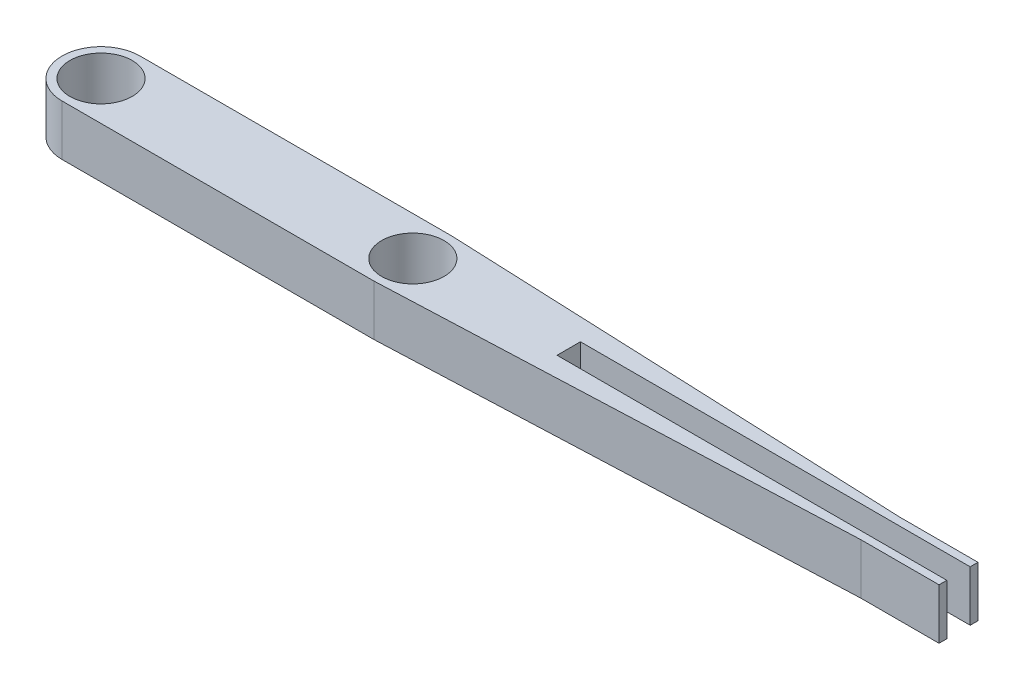
ISO-10303-21;
HEADER;
FILE_DESCRIPTION(('STEP AP214'),'2;1');
FILE_NAME('part.step','',(''),(''),'','','');
FILE_SCHEMA(('AUTOMOTIVE_DESIGN { 1 0 10303 214 1 1 1 1 }'));
ENDSEC;
DATA;
#1=APPLICATION_CONTEXT('core data for automotive mechanical design processes');
#2=APPLICATION_PROTOCOL_DEFINITION('international standard','automotive_design',2000,#1);
#3=PRODUCT_CONTEXT('',#1,'mechanical');
#4=PRODUCT('Part','Part','',(#3));
#5=PRODUCT_RELATED_PRODUCT_CATEGORY('part','',(#4));
#6=PRODUCT_DEFINITION_FORMATION('','',#4);
#7=PRODUCT_DEFINITION_CONTEXT('part definition',#1,'design');
#8=PRODUCT_DEFINITION('design','',#6,#7);
#9=PRODUCT_DEFINITION_SHAPE('','',#8);
#10=(LENGTH_UNIT() NAMED_UNIT(*) SI_UNIT(.MILLI.,.METRE.));
#11=(NAMED_UNIT(*) PLANE_ANGLE_UNIT() SI_UNIT($,.RADIAN.));
#12=(NAMED_UNIT(*) SI_UNIT($,.STERADIAN.) SOLID_ANGLE_UNIT());
#13=UNCERTAINTY_MEASURE_WITH_UNIT(LENGTH_MEASURE(1.E-05),#10,'distance_accuracy_value','');
#14=(GEOMETRIC_REPRESENTATION_CONTEXT(3) GLOBAL_UNCERTAINTY_ASSIGNED_CONTEXT((#13)) GLOBAL_UNIT_ASSIGNED_CONTEXT((#10,
#11,#12)) REPRESENTATION_CONTEXT('',''));
#15=CARTESIAN_POINT('',(0.,0.,0.));
#16=DIRECTION('',(0.,0.,1.));
#17=DIRECTION('',(1.,0.,0.));
#18=AXIS2_PLACEMENT_3D('',#15,#16,#17);
#19=CARTESIAN_POINT('',(0.,6.5,0.));
#20=DIRECTION('',(0.,1.,0.));
#21=DIRECTION('',(0.,0.,1.));
#22=AXIS2_PLACEMENT_3D('',#19,#20,#21);
#23=PLANE('',#22);
#24=CARTESIAN_POINT('',(40.,6.5,0.));
#25=DIRECTION('',(0.,1.,0.));
#26=DIRECTION('',(0.,0.,1.));
#27=AXIS2_PLACEMENT_3D('',#24,#25,#26);
#28=CIRCLE('',#27,4.);
#29=CARTESIAN_POINT('',(40.,6.5,-4.));
#30=VERTEX_POINT('',#29);
#31=EDGE_CURVE('E129',#30,#30,#28,.T.);
#32=ORIENTED_EDGE('',*,*,#31,.F.);
#33=EDGE_LOOP('',(#32));
#34=FACE_BOUND('',#33,.T.);
#35=CARTESIAN_POINT('',(0.,6.5,0.));
#36=DIRECTION('',(0.,1.,0.));
#37=DIRECTION('',(0.,0.,1.));
#38=AXIS2_PLACEMENT_3D('',#35,#36,#37);
#39=CIRCLE('',#38,4.);
#40=CARTESIAN_POINT('',(0.,6.5,-4.));
#41=VERTEX_POINT('',#40);
#42=EDGE_CURVE('E125',#41,#41,#39,.T.);
#43=ORIENTED_EDGE('',*,*,#42,.F.);
#44=EDGE_LOOP('',(#43));
#45=FACE_BOUND('',#44,.T.);
#46=DIRECTION('',(0.,0.,-1.));
#47=VECTOR('',#46,1.);
#48=CARTESIAN_POINT('',(60.,6.5,1.50000000000001));
#49=LINE('',#48,#47);
#50=CARTESIAN_POINT('',(60.,6.5,1.50000000000001));
#51=VERTEX_POINT('',#50);
#52=CARTESIAN_POINT('',(60.,6.5,-1.5));
#53=VERTEX_POINT('',#52);
#54=EDGE_CURVE('E165',#51,#53,#49,.T.);
#55=ORIENTED_EDGE('',*,*,#54,.T.);
#56=DIRECTION('',(1.,0.,0.));
#57=VECTOR('',#56,1.);
#58=CARTESIAN_POINT('',(60.,6.5,-1.5));
#59=LINE('',#58,#57);
#60=CARTESIAN_POINT('',(110.,6.5,-1.5));
#61=VERTEX_POINT('',#60);
#62=EDGE_CURVE('E162',#53,#61,#59,.T.);
#63=ORIENTED_EDGE('',*,*,#62,.T.);
#64=DIRECTION('',(0.,0.,1.));
#65=VECTOR('',#64,1.);
#66=CARTESIAN_POINT('',(110.,6.5,-1.5));
#67=LINE('',#66,#65);
#68=CARTESIAN_POINT('',(110.,6.5,-2.5));
#69=VERTEX_POINT('',#68);
#70=EDGE_CURVE('E200',#69,#61,#67,.T.);
#71=ORIENTED_EDGE('',*,*,#70,.F.);
#72=DIRECTION('',(-1.,0.,0.));
#73=VECTOR('',#72,1.);
#74=CARTESIAN_POINT('',(110.,6.5,-2.5));
#75=LINE('',#74,#73);
#76=CARTESIAN_POINT('',(100.,6.5,-2.5));
#77=VERTEX_POINT('',#76);
#78=EDGE_CURVE('E203',#69,#77,#75,.T.);
#79=ORIENTED_EDGE('',*,*,#78,.T.);
#80=DIRECTION('',(0.999133073092352,0.,0.0416305447121813));
#81=VECTOR('',#80,1.);
#82=CARTESIAN_POINT('',(0.277296360485268,6.5,-6.65511265164644));
#83=LINE('',#82,#81);
#84=CARTESIAN_POINT('',(40.,6.5,-5.));
#85=VERTEX_POINT('',#84);
#86=EDGE_CURVE('E148',#85,#77,#83,.T.);
#87=ORIENTED_EDGE('',*,*,#86,.F.);
#88=DIRECTION('',(1.,0.,0.));
#89=VECTOR('',#88,1.);
#90=CARTESIAN_POINT('',(0.,6.5,-5.));
#91=LINE('',#90,#89);
#92=CARTESIAN_POINT('',(0.,6.5,-5.));
#93=VERTEX_POINT('',#92);
#94=EDGE_CURVE('E110',#93,#85,#91,.T.);
#95=ORIENTED_EDGE('',*,*,#94,.F.);
#96=CARTESIAN_POINT('',(0.,6.5,0.));
#97=DIRECTION('',(0.,1.,0.));
#98=DIRECTION('',(0.,0.,1.));
#99=AXIS2_PLACEMENT_3D('',#96,#97,#98);
#100=CIRCLE('',#99,5.);
#101=CARTESIAN_POINT('',(0.,6.5,5.));
#102=VERTEX_POINT('',#101);
#103=EDGE_CURVE('E104',#93,#102,#100,.T.);
#104=ORIENTED_EDGE('',*,*,#103,.T.);
#105=DIRECTION('',(1.,0.,0.));
#106=VECTOR('',#105,1.);
#107=CARTESIAN_POINT('',(0.,6.5,5.));
#108=LINE('',#107,#106);
#109=CARTESIAN_POINT('',(40.,6.5,5.));
#110=VERTEX_POINT('',#109);
#111=EDGE_CURVE('E96',#102,#110,#108,.T.);
#112=ORIENTED_EDGE('',*,*,#111,.T.);
#113=DIRECTION('',(0.999133073092352,0.,-0.0416305447121813));
#114=VECTOR('',#113,1.);
#115=CARTESIAN_POINT('',(0.277296360485268,6.5,6.65511265164644));
#116=LINE('',#115,#114);
#117=CARTESIAN_POINT('',(100.,6.5,2.5));
#118=VERTEX_POINT('',#117);
#119=EDGE_CURVE('E57',#110,#118,#116,.T.);
#120=ORIENTED_EDGE('',*,*,#119,.T.);
#121=DIRECTION('',(-1.,0.,0.));
#122=VECTOR('',#121,1.);
#123=CARTESIAN_POINT('',(110.,6.5,2.5));
#124=LINE('',#123,#122);
#125=CARTESIAN_POINT('',(110.,6.5,2.5));
#126=VERTEX_POINT('',#125);
#127=EDGE_CURVE('E176',#126,#118,#124,.T.);
#128=ORIENTED_EDGE('',*,*,#127,.F.);
#129=DIRECTION('',(0.,0.,1.));
#130=VECTOR('',#129,1.);
#131=CARTESIAN_POINT('',(110.,6.5,2.5));
#132=LINE('',#131,#130);
#133=CARTESIAN_POINT('',(110.,6.5,1.50000000000001));
#134=VERTEX_POINT('',#133);
#135=EDGE_CURVE('E179',#134,#126,#132,.T.);
#136=ORIENTED_EDGE('',*,*,#135,.F.);
#137=DIRECTION('',(1.,0.,0.));
#138=VECTOR('',#137,1.);
#139=CARTESIAN_POINT('',(60.,6.5,1.50000000000001));
#140=LINE('',#139,#138);
#141=EDGE_CURVE('E158',#51,#134,#140,.T.);
#142=ORIENTED_EDGE('',*,*,#141,.F.);
#143=EDGE_LOOP('',(#55,#63,#71,#79,#87,#95,#104,#112,#120,#128,#136,#142));
#144=FACE_BOUND('',#143,.T.);
#145=ADVANCED_FACE('F40',(#34,#45,#144),#23,.T.);
#146=CARTESIAN_POINT('',(0.,0.,0.));
#147=DIRECTION('',(0.,1.,0.));
#148=DIRECTION('',(0.,0.,1.));
#149=AXIS2_PLACEMENT_3D('',#146,#147,#148);
#150=PLANE('',#149);
#151=CARTESIAN_POINT('',(0.,0.,0.));
#152=DIRECTION('',(0.,1.,0.));
#153=DIRECTION('',(0.,0.,1.));
#154=AXIS2_PLACEMENT_3D('',#151,#152,#153);
#155=CIRCLE('',#154,4.);
#156=CARTESIAN_POINT('',(0.,0.,-4.));
#157=VERTEX_POINT('',#156);
#158=EDGE_CURVE('E126',#157,#157,#155,.T.);
#159=ORIENTED_EDGE('',*,*,#158,.T.);
#160=EDGE_LOOP('',(#159));
#161=FACE_BOUND('',#160,.T.);
#162=CARTESIAN_POINT('',(40.,0.,0.));
#163=DIRECTION('',(0.,1.,0.));
#164=DIRECTION('',(0.,0.,1.));
#165=AXIS2_PLACEMENT_3D('',#162,#163,#164);
#166=CIRCLE('',#165,4.);
#167=CARTESIAN_POINT('',(40.,0.,-4.));
#168=VERTEX_POINT('',#167);
#169=EDGE_CURVE('E140',#168,#168,#166,.T.);
#170=ORIENTED_EDGE('',*,*,#169,.T.);
#171=EDGE_LOOP('',(#170));
#172=FACE_BOUND('',#171,.T.);
#173=DIRECTION('',(1.,0.,0.));
#174=VECTOR('',#173,1.);
#175=CARTESIAN_POINT('',(60.,0.,-1.5));
#176=LINE('',#175,#174);
#177=CARTESIAN_POINT('',(60.,0.,-1.5));
#178=VERTEX_POINT('',#177);
#179=CARTESIAN_POINT('',(110.,0.,-1.5));
#180=VERTEX_POINT('',#179);
#181=EDGE_CURVE('E170',#178,#180,#176,.T.);
#182=ORIENTED_EDGE('',*,*,#181,.F.);
#183=DIRECTION('',(0.,0.,-1.));
#184=VECTOR('',#183,1.);
#185=CARTESIAN_POINT('',(60.,0.,1.50000000000001));
#186=LINE('',#185,#184);
#187=CARTESIAN_POINT('',(60.,0.,1.50000000000001));
#188=VERTEX_POINT('',#187);
#189=EDGE_CURVE('E161',#188,#178,#186,.T.);
#190=ORIENTED_EDGE('',*,*,#189,.F.);
#191=DIRECTION('',(1.,0.,0.));
#192=VECTOR('',#191,1.);
#193=CARTESIAN_POINT('',(60.,0.,1.50000000000001));
#194=LINE('',#193,#192);
#195=CARTESIAN_POINT('',(110.,0.,1.50000000000001));
#196=VERTEX_POINT('',#195);
#197=EDGE_CURVE('E157',#188,#196,#194,.T.);
#198=ORIENTED_EDGE('',*,*,#197,.T.);
#199=DIRECTION('',(0.,0.,-1.));
#200=VECTOR('',#199,1.);
#201=CARTESIAN_POINT('',(110.,0.,2.5));
#202=LINE('',#201,#200);
#203=CARTESIAN_POINT('',(110.,0.,2.5));
#204=VERTEX_POINT('',#203);
#205=EDGE_CURVE('E185',#204,#196,#202,.T.);
#206=ORIENTED_EDGE('',*,*,#205,.F.);
#207=DIRECTION('',(-1.,0.,0.));
#208=VECTOR('',#207,1.);
#209=CARTESIAN_POINT('',(110.,0.,2.5));
#210=LINE('',#209,#208);
#211=CARTESIAN_POINT('',(100.,0.,2.5));
#212=VERTEX_POINT('',#211);
#213=EDGE_CURVE('E167',#204,#212,#210,.T.);
#214=ORIENTED_EDGE('',*,*,#213,.T.);
#215=DIRECTION('',(0.999133073092352,0.,-0.0416305447121813));
#216=VECTOR('',#215,1.);
#217=CARTESIAN_POINT('',(0.277296360485268,0.,6.65511265164644));
#218=LINE('',#217,#216);
#219=CARTESIAN_POINT('',(40.,0.,5.));
#220=VERTEX_POINT('',#219);
#221=EDGE_CURVE('E76',#220,#212,#218,.T.);
#222=ORIENTED_EDGE('',*,*,#221,.F.);
#223=DIRECTION('',(1.,0.,0.));
#224=VECTOR('',#223,1.);
#225=CARTESIAN_POINT('',(0.,0.,5.));
#226=LINE('',#225,#224);
#227=CARTESIAN_POINT('',(0.,0.,5.));
#228=VERTEX_POINT('',#227);
#229=EDGE_CURVE('E131',#228,#220,#226,.T.);
#230=ORIENTED_EDGE('',*,*,#229,.F.);
#231=CARTESIAN_POINT('',(0.,0.,0.));
#232=DIRECTION('',(0.,1.,0.));
#233=DIRECTION('',(0.,0.,1.));
#234=AXIS2_PLACEMENT_3D('',#231,#232,#233);
#235=CIRCLE('',#234,5.);
#236=CARTESIAN_POINT('',(0.,0.,-5.));
#237=VERTEX_POINT('',#236);
#238=EDGE_CURVE('E115',#237,#228,#235,.T.);
#239=ORIENTED_EDGE('',*,*,#238,.F.);
#240=DIRECTION('',(1.,0.,0.));
#241=VECTOR('',#240,1.);
#242=CARTESIAN_POINT('',(0.,0.,-5.));
#243=LINE('',#242,#241);
#244=CARTESIAN_POINT('',(40.,0.,-5.));
#245=VERTEX_POINT('',#244);
#246=EDGE_CURVE('E134',#237,#245,#243,.T.);
#247=ORIENTED_EDGE('',*,*,#246,.T.);
#248=DIRECTION('',(0.999133073092352,0.,0.0416305447121813));
#249=VECTOR('',#248,1.);
#250=CARTESIAN_POINT('',(0.277296360485268,0.,-6.65511265164644));
#251=LINE('',#250,#249);
#252=CARTESIAN_POINT('',(100.,0.,-2.5));
#253=VERTEX_POINT('',#252);
#254=EDGE_CURVE('E137',#245,#253,#251,.T.);
#255=ORIENTED_EDGE('',*,*,#254,.T.);
#256=DIRECTION('',(-1.,0.,0.));
#257=VECTOR('',#256,1.);
#258=CARTESIAN_POINT('',(110.,0.,-2.5));
#259=LINE('',#258,#257);
#260=CARTESIAN_POINT('',(110.,0.,-2.5));
#261=VERTEX_POINT('',#260);
#262=EDGE_CURVE('E206',#261,#253,#259,.T.);
#263=ORIENTED_EDGE('',*,*,#262,.F.);
#264=DIRECTION('',(0.,0.,-1.));
#265=VECTOR('',#264,1.);
#266=CARTESIAN_POINT('',(110.,0.,-1.5));
#267=LINE('',#266,#265);
#268=EDGE_CURVE('E194',#180,#261,#267,.T.);
#269=ORIENTED_EDGE('',*,*,#268,.F.);
#270=EDGE_LOOP('',(#182,#190,#198,#206,#214,#222,#230,#239,#247,#255,#263,#269));
#271=FACE_BOUND('',#270,.T.);
#272=ADVANCED_FACE('F222',(#161,#172,#271),#150,.F.);
#273=CARTESIAN_POINT('',(0.277296360485268,6.5,-6.65511265164644));
#274=DIRECTION('',(0.0416305447121813,0.,-0.999133073092352));
#275=DIRECTION('',(-0.999133073092352,0.,-0.0416305447121813));
#276=AXIS2_PLACEMENT_3D('',#273,#274,#275);
#277=PLANE('',#276);
#278=ORIENTED_EDGE('',*,*,#254,.F.);
#279=DIRECTION('',(0.,-1.,0.));
#280=VECTOR('',#279,1.);
#281=CARTESIAN_POINT('',(40.,6.5,-5.));
#282=LINE('',#281,#280);
#283=EDGE_CURVE('E11',#85,#245,#282,.T.);
#284=ORIENTED_EDGE('',*,*,#283,.F.);
#285=ORIENTED_EDGE('',*,*,#86,.T.);
#286=DIRECTION('',(0.,-1.,0.));
#287=VECTOR('',#286,1.);
#288=CARTESIAN_POINT('',(100.,6.5,-2.5));
#289=LINE('',#288,#287);
#290=EDGE_CURVE('E122',#77,#253,#289,.T.);
#291=ORIENTED_EDGE('',*,*,#290,.T.);
#292=EDGE_LOOP('',(#278,#284,#285,#291));
#293=FACE_BOUND('',#292,.T.);
#294=ADVANCED_FACE('F220',(#293),#277,.T.);
#295=CARTESIAN_POINT('',(0.,6.5,-5.));
#296=DIRECTION('',(0.,0.,-1.));
#297=DIRECTION('',(-1.,0.,0.));
#298=AXIS2_PLACEMENT_3D('',#295,#296,#297);
#299=PLANE('',#298);
#300=ORIENTED_EDGE('',*,*,#246,.F.);
#301=DIRECTION('',(0.,-1.,0.));
#302=VECTOR('',#301,1.);
#303=CARTESIAN_POINT('',(0.,6.5,-5.));
#304=LINE('',#303,#302);
#305=EDGE_CURVE('E49',#93,#237,#304,.T.);
#306=ORIENTED_EDGE('',*,*,#305,.F.);
#307=ORIENTED_EDGE('',*,*,#94,.T.);
#308=ORIENTED_EDGE('',*,*,#283,.T.);
#309=EDGE_LOOP('',(#300,#306,#307,#308));
#310=FACE_BOUND('',#309,.T.);
#311=ADVANCED_FACE('F225',(#310),#299,.T.);
#312=CARTESIAN_POINT('',(0.,6.5,0.));
#313=DIRECTION('',(0.,-1.,0.));
#314=DIRECTION('',(0.,0.,-1.));
#315=AXIS2_PLACEMENT_3D('',#312,#313,#314);
#316=CYLINDRICAL_SURFACE('',#315,5.);
#317=ORIENTED_EDGE('',*,*,#238,.T.);
#318=DIRECTION('',(0.,-1.,0.));
#319=VECTOR('',#318,1.);
#320=CARTESIAN_POINT('',(0.,6.5,5.));
#321=LINE('',#320,#319);
#322=EDGE_CURVE('E101',#102,#228,#321,.T.);
#323=ORIENTED_EDGE('',*,*,#322,.F.);
#324=ORIENTED_EDGE('',*,*,#103,.F.);
#325=ORIENTED_EDGE('',*,*,#305,.T.);
#326=EDGE_LOOP('',(#317,#323,#324,#325));
#327=FACE_BOUND('',#326,.T.);
#328=ADVANCED_FACE('F113',(#327),#316,.T.);
#329=CARTESIAN_POINT('',(0.,6.5,5.));
#330=DIRECTION('',(0.,0.,-1.));
#331=DIRECTION('',(-1.,0.,0.));
#332=AXIS2_PLACEMENT_3D('',#329,#330,#331);
#333=PLANE('',#332);
#334=ORIENTED_EDGE('',*,*,#229,.T.);
#335=DIRECTION('',(0.,-1.,0.));
#336=VECTOR('',#335,1.);
#337=CARTESIAN_POINT('',(40.,6.5,5.));
#338=LINE('',#337,#336);
#339=EDGE_CURVE('E103',#110,#220,#338,.T.);
#340=ORIENTED_EDGE('',*,*,#339,.F.);
#341=ORIENTED_EDGE('',*,*,#111,.F.);
#342=ORIENTED_EDGE('',*,*,#322,.T.);
#343=EDGE_LOOP('',(#334,#340,#341,#342));
#344=FACE_BOUND('',#343,.T.);
#345=ADVANCED_FACE('F99',(#344),#333,.F.);
#346=CARTESIAN_POINT('',(0.277296360485268,6.5,6.65511265164644));
#347=DIRECTION('',(-0.0416305447121813,0.,-0.999133073092352));
#348=DIRECTION('',(-0.999133073092352,0.,0.0416305447121813));
#349=AXIS2_PLACEMENT_3D('',#346,#347,#348);
#350=PLANE('',#349);
#351=ORIENTED_EDGE('',*,*,#221,.T.);
#352=DIRECTION('',(0.,-1.,0.));
#353=VECTOR('',#352,1.);
#354=CARTESIAN_POINT('',(100.,6.5,2.5));
#355=LINE('',#354,#353);
#356=EDGE_CURVE('E117',#118,#212,#355,.T.);
#357=ORIENTED_EDGE('',*,*,#356,.F.);
#358=ORIENTED_EDGE('',*,*,#119,.F.);
#359=ORIENTED_EDGE('',*,*,#339,.T.);
#360=EDGE_LOOP('',(#351,#357,#358,#359));
#361=FACE_BOUND('',#360,.T.);
#362=ADVANCED_FACE('F251',(#361),#350,.F.);
#363=CARTESIAN_POINT('',(40.,6.5,0.));
#364=DIRECTION('',(0.,-1.,0.));
#365=DIRECTION('',(0.,0.,-1.));
#366=AXIS2_PLACEMENT_3D('',#363,#364,#365);
#367=CYLINDRICAL_SURFACE('',#366,4.);
#368=CARTESIAN_POINT('',(40.,6.5,-4.));
#369=CARTESIAN_POINT('',(40.,6.43229166666667,-4.));
#370=CARTESIAN_POINT('',(40.,6.36458333333333,-4.));
#371=CARTESIAN_POINT('',(40.,6.22916666666667,-4.));
#372=CARTESIAN_POINT('',(40.,6.16145833333333,-4.));
#373=CARTESIAN_POINT('',(40.,6.02604166666667,-4.));
#374=CARTESIAN_POINT('',(40.,5.95833333333333,-4.));
#375=CARTESIAN_POINT('',(40.,5.82291666666667,-4.));
#376=CARTESIAN_POINT('',(40.,5.75520833333333,-4.));
#377=CARTESIAN_POINT('',(40.,5.61979166666667,-4.));
#378=CARTESIAN_POINT('',(40.,5.55208333333333,-4.));
#379=CARTESIAN_POINT('',(40.,5.41666666666667,-4.));
#380=CARTESIAN_POINT('',(40.,5.34895833333333,-4.));
#381=CARTESIAN_POINT('',(40.,5.21354166666667,-4.));
#382=CARTESIAN_POINT('',(40.,5.14583333333333,-4.));
#383=CARTESIAN_POINT('',(40.,5.01041666666667,-4.));
#384=CARTESIAN_POINT('',(40.,4.94270833333333,-4.));
#385=CARTESIAN_POINT('',(40.,4.80729166666667,-4.));
#386=CARTESIAN_POINT('',(40.,4.73958333333333,-4.));
#387=CARTESIAN_POINT('',(40.,4.60416666666667,-4.));
#388=CARTESIAN_POINT('',(40.,4.53645833333333,-4.));
#389=CARTESIAN_POINT('',(40.,4.40104166666667,-4.));
#390=CARTESIAN_POINT('',(40.,4.33333333333333,-4.));
#391=CARTESIAN_POINT('',(40.,4.19791666666667,-4.));
#392=CARTESIAN_POINT('',(40.,4.13020833333333,-4.));
#393=CARTESIAN_POINT('',(40.,3.99479166666667,-4.));
#394=CARTESIAN_POINT('',(40.,3.92708333333333,-4.));
#395=CARTESIAN_POINT('',(40.,3.79166666666667,-4.));
#396=CARTESIAN_POINT('',(40.,3.72395833333333,-4.));
#397=CARTESIAN_POINT('',(40.,3.58854166666667,-4.));
#398=CARTESIAN_POINT('',(40.,3.52083333333333,-4.));
#399=CARTESIAN_POINT('',(40.,3.38541666666667,-4.));
#400=CARTESIAN_POINT('',(40.,3.31770833333333,-4.));
#401=CARTESIAN_POINT('',(40.,3.18229166666667,-4.));
#402=CARTESIAN_POINT('',(40.,3.11458333333333,-4.));
#403=CARTESIAN_POINT('',(40.,2.97916666666667,-4.));
#404=CARTESIAN_POINT('',(40.,2.91145833333333,-4.));
#405=CARTESIAN_POINT('',(40.,2.77604166666667,-4.));
#406=CARTESIAN_POINT('',(40.,2.70833333333333,-4.));
#407=CARTESIAN_POINT('',(40.,2.57291666666667,-4.));
#408=CARTESIAN_POINT('',(40.,2.50520833333333,-4.));
#409=CARTESIAN_POINT('',(40.,2.36979166666667,-4.));
#410=CARTESIAN_POINT('',(40.,2.30208333333333,-4.));
#411=CARTESIAN_POINT('',(40.,2.16666666666667,-4.));
#412=CARTESIAN_POINT('',(40.,2.09895833333333,-4.));
#413=CARTESIAN_POINT('',(40.,1.96354166666667,-4.));
#414=CARTESIAN_POINT('',(40.,1.89583333333333,-4.));
#415=CARTESIAN_POINT('',(40.,1.76041666666667,-4.));
#416=CARTESIAN_POINT('',(40.,1.69270833333333,-4.));
#417=CARTESIAN_POINT('',(40.,1.55729166666667,-4.));
#418=CARTESIAN_POINT('',(40.,1.48958333333333,-4.));
#419=CARTESIAN_POINT('',(40.,1.35416666666667,-4.));
#420=CARTESIAN_POINT('',(40.,1.28645833333333,-4.));
#421=CARTESIAN_POINT('',(40.,1.15104166666667,-4.));
#422=CARTESIAN_POINT('',(40.,1.08333333333333,-4.));
#423=CARTESIAN_POINT('',(40.,0.947916666666667,-4.));
#424=CARTESIAN_POINT('',(40.,0.880208333333333,-4.));
#425=CARTESIAN_POINT('',(40.,0.744791666666667,-4.));
#426=CARTESIAN_POINT('',(40.,0.677083333333333,-4.));
#427=CARTESIAN_POINT('',(40.,0.541666666666667,-4.));
#428=CARTESIAN_POINT('',(40.,0.473958333333333,-4.));
#429=CARTESIAN_POINT('',(40.,0.338541666666667,-4.));
#430=CARTESIAN_POINT('',(40.,0.270833333333334,-4.));
#431=CARTESIAN_POINT('',(40.,0.135416666666667,-4.));
#432=CARTESIAN_POINT('',(40.,0.0677083333333334,-4.));
#433=CARTESIAN_POINT('',(40.,0.,-4.));
#434=B_SPLINE_CURVE_WITH_KNOTS('',3,(#368,#369,#370,#371,#372,#373,#374,#375,#376,#377,#378,
#379,#380,#381,#382,#383,#384,#385,#386,#387,#388,#389,#390,#391,#392,#393,#394,#395,#396,#397,
#398,#399,#400,#401,#402,#403,#404,#405,#406,#407,#408,#409,#410,#411,#412,#413,#414,#415,#416,
#417,#418,#419,#420,#421,#422,#423,#424,#425,#426,#427,#428,#429,#430,#431,#432,#433),
.UNSPECIFIED.,.F.,.F.,(4,2,2,2,2,2,2,2,2,2,2,2,2,2,2,2,2,2,2,2,2,2,2,2,2,2,2,2,2,2,2,2,4),(0.,
0.203125,0.40625,0.609375000000001,0.812500000000001,1.015625,1.21875,1.421875,1.625,1.828125,
2.03125,2.234375,2.4375,2.640625,2.84375,3.046875,3.25,3.453125,3.65625,3.859375,4.0625,
4.265625,4.46875,4.671875,4.875,5.078125,5.28125,5.484375,5.6875,5.890625,6.09375,6.296875,6.5),.UNSPECIFIED.);
#435=EDGE_CURVE('BSEAM42',#30,#168,#434,.T.);
#436=ORIENTED_EDGE('',*,*,#31,.T.);
#437=ORIENTED_EDGE('',*,*,#169,.F.);
#438=ORIENTED_EDGE('',*,*,#435,.T.);
#439=ORIENTED_EDGE('',*,*,#435,.F.);
#440=EDGE_LOOP('',(#436,#438,#437,#439));
#441=FACE_BOUND('',#440,.T.);
#442=ADVANCED_FACE('F42',(#441),#367,.F.);
#443=CARTESIAN_POINT('',(0.,6.5,0.));
#444=DIRECTION('',(0.,-1.,0.));
#445=DIRECTION('',(0.,0.,-1.));
#446=AXIS2_PLACEMENT_3D('',#443,#444,#445);
#447=CYLINDRICAL_SURFACE('',#446,4.);
#448=CARTESIAN_POINT('',(0.,6.5,-4.));
#449=CARTESIAN_POINT('',(0.,6.43229166666667,-4.));
#450=CARTESIAN_POINT('',(0.,6.36458333333333,-4.));
#451=CARTESIAN_POINT('',(0.,6.22916666666667,-4.));
#452=CARTESIAN_POINT('',(0.,6.16145833333333,-4.));
#453=CARTESIAN_POINT('',(0.,6.02604166666667,-4.));
#454=CARTESIAN_POINT('',(0.,5.95833333333333,-4.));
#455=CARTESIAN_POINT('',(0.,5.82291666666667,-4.));
#456=CARTESIAN_POINT('',(0.,5.75520833333333,-4.));
#457=CARTESIAN_POINT('',(0.,5.61979166666667,-4.));
#458=CARTESIAN_POINT('',(0.,5.55208333333333,-4.));
#459=CARTESIAN_POINT('',(0.,5.41666666666667,-4.));
#460=CARTESIAN_POINT('',(0.,5.34895833333333,-4.));
#461=CARTESIAN_POINT('',(0.,5.21354166666667,-4.));
#462=CARTESIAN_POINT('',(0.,5.14583333333333,-4.));
#463=CARTESIAN_POINT('',(0.,5.01041666666667,-4.));
#464=CARTESIAN_POINT('',(0.,4.94270833333333,-4.));
#465=CARTESIAN_POINT('',(0.,4.80729166666667,-4.));
#466=CARTESIAN_POINT('',(0.,4.73958333333333,-4.));
#467=CARTESIAN_POINT('',(0.,4.60416666666667,-4.));
#468=CARTESIAN_POINT('',(0.,4.53645833333333,-4.));
#469=CARTESIAN_POINT('',(0.,4.40104166666667,-4.));
#470=CARTESIAN_POINT('',(0.,4.33333333333333,-4.));
#471=CARTESIAN_POINT('',(0.,4.19791666666667,-4.));
#472=CARTESIAN_POINT('',(0.,4.13020833333333,-4.));
#473=CARTESIAN_POINT('',(0.,3.99479166666667,-4.));
#474=CARTESIAN_POINT('',(0.,3.92708333333333,-4.));
#475=CARTESIAN_POINT('',(0.,3.79166666666667,-4.));
#476=CARTESIAN_POINT('',(0.,3.72395833333333,-4.));
#477=CARTESIAN_POINT('',(0.,3.58854166666667,-4.));
#478=CARTESIAN_POINT('',(0.,3.52083333333333,-4.));
#479=CARTESIAN_POINT('',(0.,3.38541666666667,-4.));
#480=CARTESIAN_POINT('',(0.,3.31770833333333,-4.));
#481=CARTESIAN_POINT('',(0.,3.18229166666667,-4.));
#482=CARTESIAN_POINT('',(0.,3.11458333333333,-4.));
#483=CARTESIAN_POINT('',(0.,2.97916666666667,-4.));
#484=CARTESIAN_POINT('',(0.,2.91145833333333,-4.));
#485=CARTESIAN_POINT('',(0.,2.77604166666667,-4.));
#486=CARTESIAN_POINT('',(0.,2.70833333333333,-4.));
#487=CARTESIAN_POINT('',(0.,2.57291666666667,-4.));
#488=CARTESIAN_POINT('',(0.,2.50520833333333,-4.));
#489=CARTESIAN_POINT('',(0.,2.36979166666667,-4.));
#490=CARTESIAN_POINT('',(0.,2.30208333333333,-4.));
#491=CARTESIAN_POINT('',(0.,2.16666666666667,-4.));
#492=CARTESIAN_POINT('',(0.,2.09895833333333,-4.));
#493=CARTESIAN_POINT('',(0.,1.96354166666667,-4.));
#494=CARTESIAN_POINT('',(0.,1.89583333333333,-4.));
#495=CARTESIAN_POINT('',(0.,1.76041666666667,-4.));
#496=CARTESIAN_POINT('',(0.,1.69270833333333,-4.));
#497=CARTESIAN_POINT('',(0.,1.55729166666667,-4.));
#498=CARTESIAN_POINT('',(0.,1.48958333333333,-4.));
#499=CARTESIAN_POINT('',(0.,1.35416666666667,-4.));
#500=CARTESIAN_POINT('',(0.,1.28645833333333,-4.));
#501=CARTESIAN_POINT('',(0.,1.15104166666667,-4.));
#502=CARTESIAN_POINT('',(0.,1.08333333333333,-4.));
#503=CARTESIAN_POINT('',(0.,0.947916666666667,-4.));
#504=CARTESIAN_POINT('',(0.,0.880208333333333,-4.));
#505=CARTESIAN_POINT('',(0.,0.744791666666667,-4.));
#506=CARTESIAN_POINT('',(0.,0.677083333333333,-4.));
#507=CARTESIAN_POINT('',(0.,0.541666666666667,-4.));
#508=CARTESIAN_POINT('',(0.,0.473958333333333,-4.));
#509=CARTESIAN_POINT('',(0.,0.338541666666667,-4.));
#510=CARTESIAN_POINT('',(0.,0.270833333333334,-4.));
#511=CARTESIAN_POINT('',(0.,0.135416666666667,-4.));
#512=CARTESIAN_POINT('',(0.,0.0677083333333334,-4.));
#513=CARTESIAN_POINT('',(0.,0.,-4.));
#514=B_SPLINE_CURVE_WITH_KNOTS('',3,(#448,#449,#450,#451,#452,#453,#454,#455,#456,#457,#458,
#459,#460,#461,#462,#463,#464,#465,#466,#467,#468,#469,#470,#471,#472,#473,#474,#475,#476,#477,
#478,#479,#480,#481,#482,#483,#484,#485,#486,#487,#488,#489,#490,#491,#492,#493,#494,#495,#496,
#497,#498,#499,#500,#501,#502,#503,#504,#505,#506,#507,#508,#509,#510,#511,#512,#513),
.UNSPECIFIED.,.F.,.F.,(4,2,2,2,2,2,2,2,2,2,2,2,2,2,2,2,2,2,2,2,2,2,2,2,2,2,2,2,2,2,2,2,4),(0.,
0.203125,0.40625,0.609375000000001,0.812500000000001,1.015625,1.21875,1.421875,1.625,1.828125,
2.03125,2.234375,2.4375,2.640625,2.84375,3.046875,3.25,3.453125,3.65625,3.859375,4.0625,
4.265625,4.46875,4.671875,4.875,5.078125,5.28125,5.484375,5.6875,5.890625,6.09375,6.296875,6.5),.UNSPECIFIED.);
#515=EDGE_CURVE('BSEAM247',#41,#157,#514,.T.);
#516=ORIENTED_EDGE('',*,*,#42,.T.);
#517=ORIENTED_EDGE('',*,*,#158,.F.);
#518=ORIENTED_EDGE('',*,*,#515,.T.);
#519=ORIENTED_EDGE('',*,*,#515,.F.);
#520=EDGE_LOOP('',(#516,#518,#517,#519));
#521=FACE_BOUND('',#520,.T.);
#522=ADVANCED_FACE('F247',(#521),#447,.F.);
#523=CARTESIAN_POINT('',(60.,0.,1.50000000000001));
#524=DIRECTION('',(1.,0.,0.));
#525=DIRECTION('',(0.,0.,-1.));
#526=AXIS2_PLACEMENT_3D('',#523,#524,#525);
#527=PLANE('',#526);
#528=ORIENTED_EDGE('',*,*,#54,.F.);
#529=DIRECTION('',(0.,1.,0.));
#530=VECTOR('',#529,1.);
#531=CARTESIAN_POINT('',(60.,0.,1.50000000000001));
#532=LINE('',#531,#530);
#533=EDGE_CURVE('E154',#188,#51,#532,.T.);
#534=ORIENTED_EDGE('',*,*,#533,.F.);
#535=ORIENTED_EDGE('',*,*,#189,.T.);
#536=DIRECTION('',(0.,1.,0.));
#537=VECTOR('',#536,1.);
#538=CARTESIAN_POINT('',(60.,0.,-1.5));
#539=LINE('',#538,#537);
#540=EDGE_CURVE('E143',#178,#53,#539,.T.);
#541=ORIENTED_EDGE('',*,*,#540,.T.);
#542=EDGE_LOOP('',(#528,#534,#535,#541));
#543=FACE_BOUND('',#542,.T.);
#544=ADVANCED_FACE('F244',(#543),#527,.T.);
#545=CARTESIAN_POINT('',(60.,0.,-1.5));
#546=DIRECTION('',(0.,0.,1.));
#547=DIRECTION('',(1.,0.,0.));
#548=AXIS2_PLACEMENT_3D('',#545,#546,#547);
#549=PLANE('',#548);
#550=ORIENTED_EDGE('',*,*,#62,.F.);
#551=ORIENTED_EDGE('',*,*,#540,.F.);
#552=ORIENTED_EDGE('',*,*,#181,.T.);
#553=DIRECTION('',(0.,-1.,0.));
#554=VECTOR('',#553,1.);
#555=CARTESIAN_POINT('',(110.,6.5,-1.5));
#556=LINE('',#555,#554);
#557=EDGE_CURVE('E191',#61,#180,#556,.T.);
#558=ORIENTED_EDGE('',*,*,#557,.F.);
#559=EDGE_LOOP('',(#550,#551,#552,#558));
#560=FACE_BOUND('',#559,.T.);
#561=ADVANCED_FACE('F281',(#560),#549,.T.);
#562=CARTESIAN_POINT('',(60.,0.,1.50000000000001));
#563=DIRECTION('',(0.,0.,1.));
#564=DIRECTION('',(1.,0.,0.));
#565=AXIS2_PLACEMENT_3D('',#562,#563,#564);
#566=PLANE('',#565);
#567=ORIENTED_EDGE('',*,*,#141,.T.);
#568=DIRECTION('',(0.,1.,0.));
#569=VECTOR('',#568,1.);
#570=CARTESIAN_POINT('',(110.,6.5,1.50000000000001));
#571=LINE('',#570,#569);
#572=EDGE_CURVE('E182',#196,#134,#571,.T.);
#573=ORIENTED_EDGE('',*,*,#572,.F.);
#574=ORIENTED_EDGE('',*,*,#197,.F.);
#575=ORIENTED_EDGE('',*,*,#533,.T.);
#576=EDGE_LOOP('',(#567,#573,#574,#575));
#577=FACE_BOUND('',#576,.T.);
#578=ADVANCED_FACE('F287',(#577),#566,.F.);
#579=CARTESIAN_POINT('',(110.,6.5,2.5));
#580=DIRECTION('',(0.,0.,-1.));
#581=DIRECTION('',(-1.,0.,0.));
#582=AXIS2_PLACEMENT_3D('',#579,#580,#581);
#583=PLANE('',#582);
#584=ORIENTED_EDGE('',*,*,#356,.T.);
#585=ORIENTED_EDGE('',*,*,#213,.F.);
#586=DIRECTION('',(0.,-1.,0.));
#587=VECTOR('',#586,1.);
#588=CARTESIAN_POINT('',(110.,6.5,2.5));
#589=LINE('',#588,#587);
#590=EDGE_CURVE('E188',#126,#204,#589,.T.);
#591=ORIENTED_EDGE('',*,*,#590,.F.);
#592=ORIENTED_EDGE('',*,*,#127,.T.);
#593=EDGE_LOOP('',(#584,#585,#591,#592));
#594=FACE_BOUND('',#593,.T.);
#595=ADVANCED_FACE('F294',(#594),#583,.F.);
#596=CARTESIAN_POINT('',(110.,0.,0.));
#597=DIRECTION('',(1.,0.,0.));
#598=DIRECTION('',(0.,0.,-1.));
#599=AXIS2_PLACEMENT_3D('',#596,#597,#598);
#600=PLANE('',#599);
#601=ORIENTED_EDGE('',*,*,#590,.T.);
#602=ORIENTED_EDGE('',*,*,#205,.T.);
#603=ORIENTED_EDGE('',*,*,#572,.T.);
#604=ORIENTED_EDGE('',*,*,#135,.T.);
#605=EDGE_LOOP('',(#601,#602,#603,#604));
#606=FACE_BOUND('',#605,.T.);
#607=ADVANCED_FACE('F302',(#606),#600,.T.);
#608=CARTESIAN_POINT('',(110.,6.5,-2.5));
#609=DIRECTION('',(0.,0.,1.));
#610=DIRECTION('',(1.,0.,0.));
#611=AXIS2_PLACEMENT_3D('',#608,#609,#610);
#612=PLANE('',#611);
#613=ORIENTED_EDGE('',*,*,#290,.F.);
#614=ORIENTED_EDGE('',*,*,#78,.F.);
#615=DIRECTION('',(0.,1.,0.));
#616=VECTOR('',#615,1.);
#617=CARTESIAN_POINT('',(110.,6.5,-2.5));
#618=LINE('',#617,#616);
#619=EDGE_CURVE('E197',#261,#69,#618,.T.);
#620=ORIENTED_EDGE('',*,*,#619,.F.);
#621=ORIENTED_EDGE('',*,*,#262,.T.);
#622=EDGE_LOOP('',(#613,#614,#620,#621));
#623=FACE_BOUND('',#622,.T.);
#624=ADVANCED_FACE('F213',(#623),#612,.F.);
#625=CARTESIAN_POINT('',(110.,0.,0.));
#626=DIRECTION('',(1.,0.,0.));
#627=DIRECTION('',(0.,0.,-1.));
#628=AXIS2_PLACEMENT_3D('',#625,#626,#627);
#629=PLANE('',#628);
#630=ORIENTED_EDGE('',*,*,#557,.T.);
#631=ORIENTED_EDGE('',*,*,#268,.T.);
#632=ORIENTED_EDGE('',*,*,#619,.T.);
#633=ORIENTED_EDGE('',*,*,#70,.T.);
#634=EDGE_LOOP('',(#630,#631,#632,#633));
#635=FACE_BOUND('',#634,.T.);
#636=ADVANCED_FACE('F317',(#635),#629,.T.);
#637=CLOSED_SHELL('',(#145,#272,#294,#311,#328,#345,#362,#442,#522,#544,#561,#578,#595,#607,
#624,#636));
#638=MANIFOLD_SOLID_BREP('B2',#637);
#639=ADVANCED_BREP_SHAPE_REPRESENTATION('',(#18,#638),#14);
#640=SHAPE_DEFINITION_REPRESENTATION(#9,#639);
ENDSEC;
END-ISO-10303-21;
